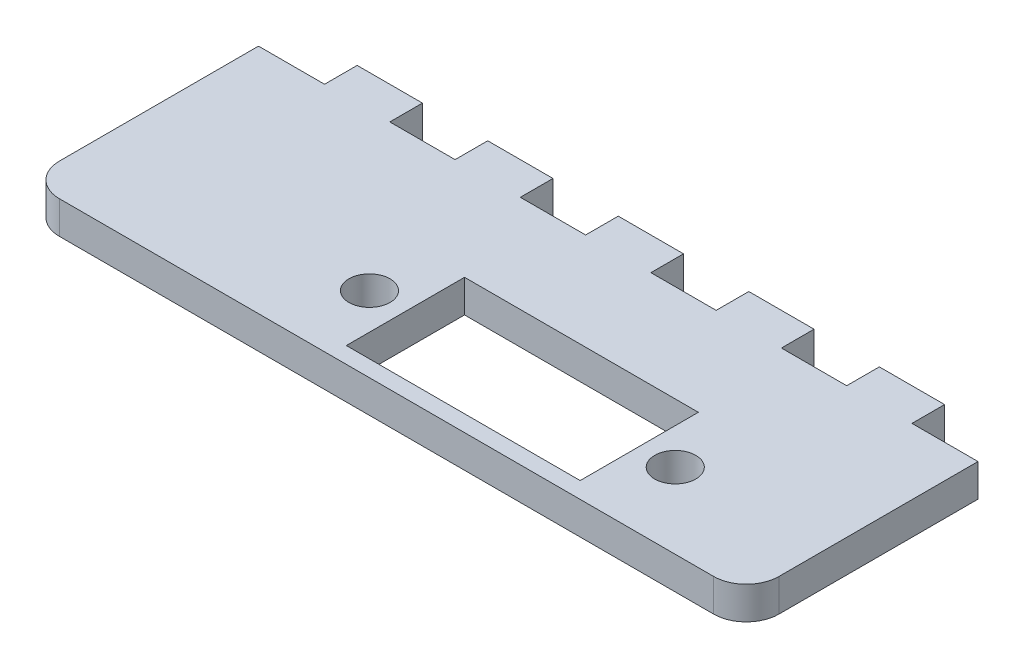
ISO-10303-21;
HEADER;
FILE_DESCRIPTION(('STEP AP214'),'2;1');
FILE_NAME('part.step','',(''),(''),'','','');
FILE_SCHEMA(('AUTOMOTIVE_DESIGN { 1 0 10303 214 1 1 1 1 }'));
ENDSEC;
DATA;
#1=APPLICATION_CONTEXT('core data for automotive mechanical design processes');
#2=APPLICATION_PROTOCOL_DEFINITION('international standard','automotive_design',2000,#1);
#3=PRODUCT_CONTEXT('',#1,'mechanical');
#4=PRODUCT('Part','Part','',(#3));
#5=PRODUCT_RELATED_PRODUCT_CATEGORY('part','',(#4));
#6=PRODUCT_DEFINITION_FORMATION('','',#4);
#7=PRODUCT_DEFINITION_CONTEXT('part definition',#1,'design');
#8=PRODUCT_DEFINITION('design','',#6,#7);
#9=PRODUCT_DEFINITION_SHAPE('','',#8);
#10=(LENGTH_UNIT() NAMED_UNIT(*) SI_UNIT(.MILLI.,.METRE.));
#11=(NAMED_UNIT(*) PLANE_ANGLE_UNIT() SI_UNIT($,.RADIAN.));
#12=(NAMED_UNIT(*) SI_UNIT($,.STERADIAN.) SOLID_ANGLE_UNIT());
#13=UNCERTAINTY_MEASURE_WITH_UNIT(LENGTH_MEASURE(1.E-05),#10,'distance_accuracy_value','');
#14=(GEOMETRIC_REPRESENTATION_CONTEXT(3) GLOBAL_UNCERTAINTY_ASSIGNED_CONTEXT((#13)) GLOBAL_UNIT_ASSIGNED_CONTEXT((#10,
#11,#12)) REPRESENTATION_CONTEXT('',''));
#15=CARTESIAN_POINT('',(0.,0.,0.));
#16=DIRECTION('',(0.,0.,1.));
#17=DIRECTION('',(1.,0.,0.));
#18=AXIS2_PLACEMENT_3D('',#15,#16,#17);
#19=CARTESIAN_POINT('',(0.,3.175,-22.5425));
#20=DIRECTION('',(0.,-1.,0.));
#21=DIRECTION('',(0.,0.,-1.));
#22=AXIS2_PLACEMENT_3D('',#19,#20,#21);
#23=PLANE('',#22);
#24=CARTESIAN_POINT('',(26.,3.175,-7.3375));
#25=DIRECTION('',(0.,1.,0.));
#26=DIRECTION('',(0.,0.,1.));
#27=AXIS2_PLACEMENT_3D('',#24,#25,#26);
#28=CIRCLE('',#27,2.);
#29=CARTESIAN_POINT('',(26.,3.175,-5.3375));
#30=VERTEX_POINT('',#29);
#31=EDGE_CURVE('E267',#30,#30,#28,.T.);
#32=ORIENTED_EDGE('',*,*,#31,.F.);
#33=EDGE_LOOP('',(#32));
#34=FACE_BOUND('',#33,.T.);
#35=DIRECTION('',(0.,0.,1.));
#36=VECTOR('',#35,1.);
#37=CARTESIAN_POINT('',(0.,3.175,0.));
#38=LINE('',#37,#36);
#39=CARTESIAN_POINT('',(0.,3.175,-22.5425));
#40=VERTEX_POINT('',#39);
#41=CARTESIAN_POINT('',(0.,3.175,-3.175));
#42=VERTEX_POINT('',#41);
#43=EDGE_CURVE('E278',#40,#42,#38,.T.);
#44=ORIENTED_EDGE('',*,*,#43,.T.);
#45=CARTESIAN_POINT('',(3.175,3.175,-3.175));
#46=DIRECTION('',(0.,-1.,0.));
#47=DIRECTION('',(0.,0.,-1.));
#48=AXIS2_PLACEMENT_3D('',#45,#46,#47);
#49=CIRCLE('',#48,3.175);
#50=CARTESIAN_POINT('',(3.175,3.175,0.));
#51=VERTEX_POINT('',#50);
#52=EDGE_CURVE('E41',#42,#51,#49,.F.);
#53=ORIENTED_EDGE('',*,*,#52,.T.);
#54=DIRECTION('',(1.,0.,0.));
#55=VECTOR('',#54,1.);
#56=CARTESIAN_POINT('',(0.,3.175,0.));
#57=LINE('',#56,#55);
#58=CARTESIAN_POINT('',(66.825,3.175,0.));
#59=VERTEX_POINT('',#58);
#60=EDGE_CURVE('E280',#51,#59,#57,.T.);
#61=ORIENTED_EDGE('',*,*,#60,.T.);
#62=CARTESIAN_POINT('',(66.825,3.175,-3.175));
#63=DIRECTION('',(0.,-1.,0.));
#64=DIRECTION('',(0.,0.,-1.));
#65=AXIS2_PLACEMENT_3D('',#62,#63,#64);
#66=CIRCLE('',#65,3.175);
#67=CARTESIAN_POINT('',(70.,3.175,-3.175));
#68=VERTEX_POINT('',#67);
#69=EDGE_CURVE('E48',#59,#68,#66,.F.);
#70=ORIENTED_EDGE('',*,*,#69,.T.);
#71=DIRECTION('',(0.,0.,-1.));
#72=VECTOR('',#71,1.);
#73=CARTESIAN_POINT('',(70.,3.175,0.));
#74=LINE('',#73,#72);
#75=CARTESIAN_POINT('',(70.,3.175,-22.5425));
#76=VERTEX_POINT('',#75);
#77=EDGE_CURVE('E283',#68,#76,#74,.T.);
#78=ORIENTED_EDGE('',*,*,#77,.T.);
#79=DIRECTION('',(-1.,0.,0.));
#80=VECTOR('',#79,1.);
#81=CARTESIAN_POINT('',(63.575,3.175,-22.5425));
#82=LINE('',#81,#80);
#83=CARTESIAN_POINT('',(63.575,3.175,-22.5425));
#84=VERTEX_POINT('',#83);
#85=EDGE_CURVE('E285',#76,#84,#82,.T.);
#86=ORIENTED_EDGE('',*,*,#85,.T.);
#87=DIRECTION('',(0.,0.,-1.));
#88=VECTOR('',#87,1.);
#89=CARTESIAN_POINT('',(63.575,3.175,-22.5425));
#90=LINE('',#89,#88);
#91=CARTESIAN_POINT('',(63.575,3.175,-25.7175));
#92=VERTEX_POINT('',#91);
#93=EDGE_CURVE('E287',#84,#92,#90,.T.);
#94=ORIENTED_EDGE('',*,*,#93,.T.);
#95=DIRECTION('',(-1.,0.,0.));
#96=VECTOR('',#95,1.);
#97=CARTESIAN_POINT('',(63.575,3.175,-25.7175));
#98=LINE('',#97,#96);
#99=CARTESIAN_POINT('',(57.225,3.175,-25.7175));
#100=VERTEX_POINT('',#99);
#101=EDGE_CURVE('E289',#92,#100,#98,.T.);
#102=ORIENTED_EDGE('',*,*,#101,.T.);
#103=DIRECTION('',(0.,0.,1.));
#104=VECTOR('',#103,1.);
#105=CARTESIAN_POINT('',(57.225,3.175,-25.7175));
#106=LINE('',#105,#104);
#107=CARTESIAN_POINT('',(57.225,3.175,-22.5425));
#108=VERTEX_POINT('',#107);
#109=EDGE_CURVE('E291',#100,#108,#106,.T.);
#110=ORIENTED_EDGE('',*,*,#109,.T.);
#111=DIRECTION('',(-1.,0.,0.));
#112=VECTOR('',#111,1.);
#113=CARTESIAN_POINT('',(50.875,3.175,-22.5425));
#114=LINE('',#113,#112);
#115=CARTESIAN_POINT('',(50.875,3.175,-22.5425));
#116=VERTEX_POINT('',#115);
#117=EDGE_CURVE('E293',#108,#116,#114,.T.);
#118=ORIENTED_EDGE('',*,*,#117,.T.);
#119=DIRECTION('',(0.,0.,-1.));
#120=VECTOR('',#119,1.);
#121=CARTESIAN_POINT('',(50.875,3.175,-22.5425));
#122=LINE('',#121,#120);
#123=CARTESIAN_POINT('',(50.875,3.175,-25.7175));
#124=VERTEX_POINT('',#123);
#125=EDGE_CURVE('E295',#116,#124,#122,.T.);
#126=ORIENTED_EDGE('',*,*,#125,.T.);
#127=DIRECTION('',(-1.,0.,0.));
#128=VECTOR('',#127,1.);
#129=CARTESIAN_POINT('',(50.875,3.175,-25.7175));
#130=LINE('',#129,#128);
#131=CARTESIAN_POINT('',(44.525,3.175,-25.7175));
#132=VERTEX_POINT('',#131);
#133=EDGE_CURVE('E297',#124,#132,#130,.T.);
#134=ORIENTED_EDGE('',*,*,#133,.T.);
#135=DIRECTION('',(0.,0.,1.));
#136=VECTOR('',#135,1.);
#137=CARTESIAN_POINT('',(44.525,3.175,-25.7175));
#138=LINE('',#137,#136);
#139=CARTESIAN_POINT('',(44.525,3.175,-22.5425));
#140=VERTEX_POINT('',#139);
#141=EDGE_CURVE('E299',#132,#140,#138,.T.);
#142=ORIENTED_EDGE('',*,*,#141,.T.);
#143=DIRECTION('',(-1.,0.,0.));
#144=VECTOR('',#143,1.);
#145=CARTESIAN_POINT('',(38.175,3.175,-22.5425));
#146=LINE('',#145,#144);
#147=CARTESIAN_POINT('',(38.175,3.175,-22.5425));
#148=VERTEX_POINT('',#147);
#149=EDGE_CURVE('E301',#140,#148,#146,.T.);
#150=ORIENTED_EDGE('',*,*,#149,.T.);
#151=DIRECTION('',(0.,0.,-1.));
#152=VECTOR('',#151,1.);
#153=CARTESIAN_POINT('',(38.175,3.175,-22.5425));
#154=LINE('',#153,#152);
#155=CARTESIAN_POINT('',(38.175,3.175,-25.7175));
#156=VERTEX_POINT('',#155);
#157=EDGE_CURVE('E303',#148,#156,#154,.T.);
#158=ORIENTED_EDGE('',*,*,#157,.T.);
#159=DIRECTION('',(-1.,0.,0.));
#160=VECTOR('',#159,1.);
#161=CARTESIAN_POINT('',(38.175,3.175,-25.7175));
#162=LINE('',#161,#160);
#163=CARTESIAN_POINT('',(31.825,3.175,-25.7175));
#164=VERTEX_POINT('',#163);
#165=EDGE_CURVE('E305',#156,#164,#162,.T.);
#166=ORIENTED_EDGE('',*,*,#165,.T.);
#167=DIRECTION('',(0.,0.,1.));
#168=VECTOR('',#167,1.);
#169=CARTESIAN_POINT('',(31.825,3.175,-25.7175));
#170=LINE('',#169,#168);
#171=CARTESIAN_POINT('',(31.825,3.175,-22.5425));
#172=VERTEX_POINT('',#171);
#173=EDGE_CURVE('E307',#164,#172,#170,.T.);
#174=ORIENTED_EDGE('',*,*,#173,.T.);
#175=DIRECTION('',(-1.,0.,0.));
#176=VECTOR('',#175,1.);
#177=CARTESIAN_POINT('',(25.475,3.175,-22.5425));
#178=LINE('',#177,#176);
#179=CARTESIAN_POINT('',(25.475,3.175,-22.5425));
#180=VERTEX_POINT('',#179);
#181=EDGE_CURVE('E309',#172,#180,#178,.T.);
#182=ORIENTED_EDGE('',*,*,#181,.T.);
#183=DIRECTION('',(0.,0.,-1.));
#184=VECTOR('',#183,1.);
#185=CARTESIAN_POINT('',(25.475,3.175,-22.5425));
#186=LINE('',#185,#184);
#187=CARTESIAN_POINT('',(25.475,3.175,-25.7174999999999));
#188=VERTEX_POINT('',#187);
#189=EDGE_CURVE('E311',#180,#188,#186,.T.);
#190=ORIENTED_EDGE('',*,*,#189,.T.);
#191=DIRECTION('',(-1.,0.,0.));
#192=VECTOR('',#191,1.);
#193=CARTESIAN_POINT('',(25.475,3.175,-25.7174999999999));
#194=LINE('',#193,#192);
#195=CARTESIAN_POINT('',(19.125,3.175,-25.7175));
#196=VERTEX_POINT('',#195);
#197=EDGE_CURVE('E313',#188,#196,#194,.T.);
#198=ORIENTED_EDGE('',*,*,#197,.T.);
#199=DIRECTION('',(0.,0.,1.));
#200=VECTOR('',#199,1.);
#201=CARTESIAN_POINT('',(19.125,3.175,-25.7175));
#202=LINE('',#201,#200);
#203=CARTESIAN_POINT('',(19.125,3.175,-22.5425));
#204=VERTEX_POINT('',#203);
#205=EDGE_CURVE('E315',#196,#204,#202,.T.);
#206=ORIENTED_EDGE('',*,*,#205,.T.);
#207=DIRECTION('',(-1.,0.,0.));
#208=VECTOR('',#207,1.);
#209=CARTESIAN_POINT('',(12.775,3.175,-22.5425));
#210=LINE('',#209,#208);
#211=CARTESIAN_POINT('',(12.775,3.175,-22.5425));
#212=VERTEX_POINT('',#211);
#213=EDGE_CURVE('E317',#204,#212,#210,.T.);
#214=ORIENTED_EDGE('',*,*,#213,.T.);
#215=DIRECTION('',(0.,0.,-1.));
#216=VECTOR('',#215,1.);
#217=CARTESIAN_POINT('',(12.775,3.175,-22.5425));
#218=LINE('',#217,#216);
#219=CARTESIAN_POINT('',(12.775,3.175,-25.7175));
#220=VERTEX_POINT('',#219);
#221=EDGE_CURVE('E319',#212,#220,#218,.T.);
#222=ORIENTED_EDGE('',*,*,#221,.T.);
#223=DIRECTION('',(-1.,0.,0.));
#224=VECTOR('',#223,1.);
#225=CARTESIAN_POINT('',(12.775,3.175,-25.7175));
#226=LINE('',#225,#224);
#227=CARTESIAN_POINT('',(6.42500000000001,3.175,-25.7175));
#228=VERTEX_POINT('',#227);
#229=EDGE_CURVE('E321',#220,#228,#226,.T.);
#230=ORIENTED_EDGE('',*,*,#229,.T.);
#231=DIRECTION('',(0.,0.,1.));
#232=VECTOR('',#231,1.);
#233=CARTESIAN_POINT('',(6.42500000000001,3.175,-25.7175));
#234=LINE('',#233,#232);
#235=CARTESIAN_POINT('',(6.42500000000001,3.175,-22.5425));
#236=VERTEX_POINT('',#235);
#237=EDGE_CURVE('E323',#228,#236,#234,.T.);
#238=ORIENTED_EDGE('',*,*,#237,.T.);
#239=DIRECTION('',(-1.,0.,0.));
#240=VECTOR('',#239,1.);
#241=CARTESIAN_POINT('',(0.,3.175,-22.5425));
#242=LINE('',#241,#240);
#243=EDGE_CURVE('E325',#236,#40,#242,.T.);
#244=ORIENTED_EDGE('',*,*,#243,.T.);
#245=EDGE_LOOP('',(#44,#53,#61,#70,#78,#86,#94,#102,#110,#118,#126,#134,#142,#150,#158,#166,
#174,#182,#190,#198,#206,#214,#222,#230,#238,#244));
#246=FACE_BOUND('',#245,.T.);
#247=DIRECTION('',(0.,0.,1.));
#248=VECTOR('',#247,1.);
#249=CARTESIAN_POINT('',(29.5,3.175,-1.5875));
#250=LINE('',#249,#248);
#251=CARTESIAN_POINT('',(29.5,3.175,-13.0875));
#252=VERTEX_POINT('',#251);
#253=CARTESIAN_POINT('',(29.5,3.175,-1.5875));
#254=VERTEX_POINT('',#253);
#255=EDGE_CURVE('E234',#252,#254,#250,.T.);
#256=ORIENTED_EDGE('',*,*,#255,.F.);
#257=DIRECTION('',(-1.,0.,0.));
#258=VECTOR('',#257,1.);
#259=CARTESIAN_POINT('',(29.5,3.175,-13.0875));
#260=LINE('',#259,#258);
#261=CARTESIAN_POINT('',(52.25,3.175,-13.0875));
#262=VERTEX_POINT('',#261);
#263=EDGE_CURVE('E260',#262,#252,#260,.T.);
#264=ORIENTED_EDGE('',*,*,#263,.F.);
#265=DIRECTION('',(0.,0.,-1.));
#266=VECTOR('',#265,1.);
#267=CARTESIAN_POINT('',(52.25,3.175,-1.5875));
#268=LINE('',#267,#266);
#269=CARTESIAN_POINT('',(52.25,3.175,-1.5875));
#270=VERTEX_POINT('',#269);
#271=EDGE_CURVE('E258',#270,#262,#268,.T.);
#272=ORIENTED_EDGE('',*,*,#271,.F.);
#273=DIRECTION('',(1.,0.,0.));
#274=VECTOR('',#273,1.);
#275=CARTESIAN_POINT('',(29.5,3.175,-1.5875));
#276=LINE('',#275,#274);
#277=EDGE_CURVE('E244',#254,#270,#276,.T.);
#278=ORIENTED_EDGE('',*,*,#277,.F.);
#279=EDGE_LOOP('',(#256,#264,#272,#278));
#280=FACE_BOUND('',#279,.T.);
#281=CARTESIAN_POINT('',(55.75,3.175,-7.3375));
#282=DIRECTION('',(0.,1.,0.));
#283=DIRECTION('',(0.,0.,-1.));
#284=AXIS2_PLACEMENT_3D('',#281,#282,#283);
#285=CIRCLE('',#284,2.);
#286=CARTESIAN_POINT('',(55.75,3.175,-9.3375));
#287=VERTEX_POINT('',#286);
#288=EDGE_CURVE('E859',#287,#287,#285,.T.);
#289=ORIENTED_EDGE('',*,*,#288,.F.);
#290=EDGE_LOOP('',(#289));
#291=FACE_BOUND('',#290,.T.);
#292=ADVANCED_FACE('F33',(#34,#246,#280,#291),#23,.F.);
#293=CARTESIAN_POINT('',(0.,0.,-22.5425));
#294=DIRECTION('',(0.,-1.,0.));
#295=DIRECTION('',(0.,0.,-1.));
#296=AXIS2_PLACEMENT_3D('',#293,#294,#295);
#297=PLANE('',#296);
#298=CARTESIAN_POINT('',(26.,0.,-7.3375));
#299=DIRECTION('',(0.,1.,0.));
#300=DIRECTION('',(0.,0.,1.));
#301=AXIS2_PLACEMENT_3D('',#298,#299,#300);
#302=CIRCLE('',#301,2.);
#303=CARTESIAN_POINT('',(26.,0.,-5.3375));
#304=VERTEX_POINT('',#303);
#305=EDGE_CURVE('E865',#304,#304,#302,.T.);
#306=ORIENTED_EDGE('',*,*,#305,.T.);
#307=EDGE_LOOP('',(#306));
#308=FACE_BOUND('',#307,.T.);
#309=DIRECTION('',(1.,0.,0.));
#310=VECTOR('',#309,1.);
#311=CARTESIAN_POINT('',(0.,0.,0.));
#312=LINE('',#311,#310);
#313=CARTESIAN_POINT('',(3.175,0.,0.));
#314=VERTEX_POINT('',#313);
#315=CARTESIAN_POINT('',(66.825,0.,0.));
#316=VERTEX_POINT('',#315);
#317=EDGE_CURVE('E329',#314,#316,#312,.T.);
#318=ORIENTED_EDGE('',*,*,#317,.F.);
#319=CARTESIAN_POINT('',(3.175,0.,-3.175));
#320=DIRECTION('',(0.,-1.,0.));
#321=DIRECTION('',(0.,0.,-1.));
#322=AXIS2_PLACEMENT_3D('',#319,#320,#321);
#323=CIRCLE('',#322,3.175);
#324=CARTESIAN_POINT('',(0.,0.,-3.175));
#325=VERTEX_POINT('',#324);
#326=EDGE_CURVE('E447',#314,#325,#323,.T.);
#327=ORIENTED_EDGE('',*,*,#326,.T.);
#328=DIRECTION('',(0.,0.,1.));
#329=VECTOR('',#328,1.);
#330=CARTESIAN_POINT('',(0.,0.,0.));
#331=LINE('',#330,#329);
#332=CARTESIAN_POINT('',(0.,0.,-22.5425));
#333=VERTEX_POINT('',#332);
#334=EDGE_CURVE('E252',#333,#325,#331,.T.);
#335=ORIENTED_EDGE('',*,*,#334,.F.);
#336=DIRECTION('',(-1.,0.,0.));
#337=VECTOR('',#336,1.);
#338=CARTESIAN_POINT('',(0.,0.,-22.5425));
#339=LINE('',#338,#337);
#340=CARTESIAN_POINT('',(6.42500000000001,0.,-22.5425));
#341=VERTEX_POINT('',#340);
#342=EDGE_CURVE('E281',#341,#333,#339,.T.);
#343=ORIENTED_EDGE('',*,*,#342,.F.);
#344=DIRECTION('',(0.,0.,1.));
#345=VECTOR('',#344,1.);
#346=CARTESIAN_POINT('',(6.42500000000001,0.,-25.7175));
#347=LINE('',#346,#345);
#348=CARTESIAN_POINT('',(6.42500000000001,0.,-25.7175));
#349=VERTEX_POINT('',#348);
#350=EDGE_CURVE('E372',#349,#341,#347,.T.);
#351=ORIENTED_EDGE('',*,*,#350,.F.);
#352=DIRECTION('',(-1.,0.,0.));
#353=VECTOR('',#352,1.);
#354=CARTESIAN_POINT('',(12.775,0.,-25.7175));
#355=LINE('',#354,#353);
#356=CARTESIAN_POINT('',(12.775,0.,-25.7175));
#357=VERTEX_POINT('',#356);
#358=EDGE_CURVE('E370',#357,#349,#355,.T.);
#359=ORIENTED_EDGE('',*,*,#358,.F.);
#360=DIRECTION('',(0.,0.,-1.));
#361=VECTOR('',#360,1.);
#362=CARTESIAN_POINT('',(12.775,0.,-22.5425));
#363=LINE('',#362,#361);
#364=CARTESIAN_POINT('',(12.775,0.,-22.5425));
#365=VERTEX_POINT('',#364);
#366=EDGE_CURVE('E368',#365,#357,#363,.T.);
#367=ORIENTED_EDGE('',*,*,#366,.F.);
#368=DIRECTION('',(-1.,0.,0.));
#369=VECTOR('',#368,1.);
#370=CARTESIAN_POINT('',(12.775,0.,-22.5425));
#371=LINE('',#370,#369);
#372=CARTESIAN_POINT('',(19.125,0.,-22.5425));
#373=VERTEX_POINT('',#372);
#374=EDGE_CURVE('E366',#373,#365,#371,.T.);
#375=ORIENTED_EDGE('',*,*,#374,.F.);
#376=DIRECTION('',(0.,0.,1.));
#377=VECTOR('',#376,1.);
#378=CARTESIAN_POINT('',(19.125,0.,-25.7175));
#379=LINE('',#378,#377);
#380=CARTESIAN_POINT('',(19.125,0.,-25.7175));
#381=VERTEX_POINT('',#380);
#382=EDGE_CURVE('E364',#381,#373,#379,.T.);
#383=ORIENTED_EDGE('',*,*,#382,.F.);
#384=DIRECTION('',(-1.,0.,0.));
#385=VECTOR('',#384,1.);
#386=CARTESIAN_POINT('',(25.475,0.,-25.7174999999999));
#387=LINE('',#386,#385);
#388=CARTESIAN_POINT('',(25.475,0.,-25.7174999999999));
#389=VERTEX_POINT('',#388);
#390=EDGE_CURVE('E362',#389,#381,#387,.T.);
#391=ORIENTED_EDGE('',*,*,#390,.F.);
#392=DIRECTION('',(0.,0.,-1.));
#393=VECTOR('',#392,1.);
#394=CARTESIAN_POINT('',(25.475,0.,-22.5425));
#395=LINE('',#394,#393);
#396=CARTESIAN_POINT('',(25.475,0.,-22.5425));
#397=VERTEX_POINT('',#396);
#398=EDGE_CURVE('E360',#397,#389,#395,.T.);
#399=ORIENTED_EDGE('',*,*,#398,.F.);
#400=DIRECTION('',(-1.,0.,0.));
#401=VECTOR('',#400,1.);
#402=CARTESIAN_POINT('',(25.475,0.,-22.5425));
#403=LINE('',#402,#401);
#404=CARTESIAN_POINT('',(31.825,0.,-22.5425));
#405=VERTEX_POINT('',#404);
#406=EDGE_CURVE('E358',#405,#397,#403,.T.);
#407=ORIENTED_EDGE('',*,*,#406,.F.);
#408=DIRECTION('',(0.,0.,1.));
#409=VECTOR('',#408,1.);
#410=CARTESIAN_POINT('',(31.825,0.,-25.7175));
#411=LINE('',#410,#409);
#412=CARTESIAN_POINT('',(31.825,0.,-25.7175));
#413=VERTEX_POINT('',#412);
#414=EDGE_CURVE('E356',#413,#405,#411,.T.);
#415=ORIENTED_EDGE('',*,*,#414,.F.);
#416=DIRECTION('',(-1.,0.,0.));
#417=VECTOR('',#416,1.);
#418=CARTESIAN_POINT('',(38.175,0.,-25.7175));
#419=LINE('',#418,#417);
#420=CARTESIAN_POINT('',(38.175,0.,-25.7175));
#421=VERTEX_POINT('',#420);
#422=EDGE_CURVE('E354',#421,#413,#419,.T.);
#423=ORIENTED_EDGE('',*,*,#422,.F.);
#424=DIRECTION('',(0.,0.,-1.));
#425=VECTOR('',#424,1.);
#426=CARTESIAN_POINT('',(38.175,0.,-22.5425));
#427=LINE('',#426,#425);
#428=CARTESIAN_POINT('',(38.175,0.,-22.5425));
#429=VERTEX_POINT('',#428);
#430=EDGE_CURVE('E352',#429,#421,#427,.T.);
#431=ORIENTED_EDGE('',*,*,#430,.F.);
#432=DIRECTION('',(-1.,0.,0.));
#433=VECTOR('',#432,1.);
#434=CARTESIAN_POINT('',(38.175,0.,-22.5425));
#435=LINE('',#434,#433);
#436=CARTESIAN_POINT('',(44.525,0.,-22.5425));
#437=VERTEX_POINT('',#436);
#438=EDGE_CURVE('E350',#437,#429,#435,.T.);
#439=ORIENTED_EDGE('',*,*,#438,.F.);
#440=DIRECTION('',(0.,0.,1.));
#441=VECTOR('',#440,1.);
#442=CARTESIAN_POINT('',(44.525,0.,-25.7175));
#443=LINE('',#442,#441);
#444=CARTESIAN_POINT('',(44.525,0.,-25.7175));
#445=VERTEX_POINT('',#444);
#446=EDGE_CURVE('E348',#445,#437,#443,.T.);
#447=ORIENTED_EDGE('',*,*,#446,.F.);
#448=DIRECTION('',(-1.,0.,0.));
#449=VECTOR('',#448,1.);
#450=CARTESIAN_POINT('',(50.875,0.,-25.7175));
#451=LINE('',#450,#449);
#452=CARTESIAN_POINT('',(50.875,0.,-25.7175));
#453=VERTEX_POINT('',#452);
#454=EDGE_CURVE('E346',#453,#445,#451,.T.);
#455=ORIENTED_EDGE('',*,*,#454,.F.);
#456=DIRECTION('',(0.,0.,-1.));
#457=VECTOR('',#456,1.);
#458=CARTESIAN_POINT('',(50.875,0.,-22.5425));
#459=LINE('',#458,#457);
#460=CARTESIAN_POINT('',(50.875,0.,-22.5425));
#461=VERTEX_POINT('',#460);
#462=EDGE_CURVE('E344',#461,#453,#459,.T.);
#463=ORIENTED_EDGE('',*,*,#462,.F.);
#464=DIRECTION('',(-1.,0.,0.));
#465=VECTOR('',#464,1.);
#466=CARTESIAN_POINT('',(50.875,0.,-22.5425));
#467=LINE('',#466,#465);
#468=CARTESIAN_POINT('',(57.225,0.,-22.5425));
#469=VERTEX_POINT('',#468);
#470=EDGE_CURVE('E342',#469,#461,#467,.T.);
#471=ORIENTED_EDGE('',*,*,#470,.F.);
#472=DIRECTION('',(0.,0.,1.));
#473=VECTOR('',#472,1.);
#474=CARTESIAN_POINT('',(57.225,0.,-25.7175));
#475=LINE('',#474,#473);
#476=CARTESIAN_POINT('',(57.225,0.,-25.7175));
#477=VERTEX_POINT('',#476);
#478=EDGE_CURVE('E340',#477,#469,#475,.T.);
#479=ORIENTED_EDGE('',*,*,#478,.F.);
#480=DIRECTION('',(-1.,0.,0.));
#481=VECTOR('',#480,1.);
#482=CARTESIAN_POINT('',(63.575,0.,-25.7175));
#483=LINE('',#482,#481);
#484=CARTESIAN_POINT('',(63.575,0.,-25.7175));
#485=VERTEX_POINT('',#484);
#486=EDGE_CURVE('E338',#485,#477,#483,.T.);
#487=ORIENTED_EDGE('',*,*,#486,.F.);
#488=DIRECTION('',(0.,0.,-1.));
#489=VECTOR('',#488,1.);
#490=CARTESIAN_POINT('',(63.575,0.,-22.5425));
#491=LINE('',#490,#489);
#492=CARTESIAN_POINT('',(63.575,0.,-22.5425));
#493=VERTEX_POINT('',#492);
#494=EDGE_CURVE('E336',#493,#485,#491,.T.);
#495=ORIENTED_EDGE('',*,*,#494,.F.);
#496=DIRECTION('',(-1.,0.,0.));
#497=VECTOR('',#496,1.);
#498=CARTESIAN_POINT('',(63.575,0.,-22.5425));
#499=LINE('',#498,#497);
#500=CARTESIAN_POINT('',(70.,0.,-22.5425));
#501=VERTEX_POINT('',#500);
#502=EDGE_CURVE('E334',#501,#493,#499,.T.);
#503=ORIENTED_EDGE('',*,*,#502,.F.);
#504=DIRECTION('',(0.,0.,-1.));
#505=VECTOR('',#504,1.);
#506=CARTESIAN_POINT('',(70.,0.,0.));
#507=LINE('',#506,#505);
#508=CARTESIAN_POINT('',(70.,0.,-3.175));
#509=VERTEX_POINT('',#508);
#510=EDGE_CURVE('E332',#509,#501,#507,.T.);
#511=ORIENTED_EDGE('',*,*,#510,.F.);
#512=CARTESIAN_POINT('',(66.825,0.,-3.175));
#513=DIRECTION('',(0.,-1.,0.));
#514=DIRECTION('',(0.,0.,-1.));
#515=AXIS2_PLACEMENT_3D('',#512,#513,#514);
#516=CIRCLE('',#515,3.175);
#517=EDGE_CURVE('E445',#509,#316,#516,.T.);
#518=ORIENTED_EDGE('',*,*,#517,.T.);
#519=EDGE_LOOP('',(#318,#327,#335,#343,#351,#359,#367,#375,#383,#391,#399,#407,#415,#423,#431,
#439,#447,#455,#463,#471,#479,#487,#495,#503,#511,#518));
#520=FACE_BOUND('',#519,.T.);
#521=DIRECTION('',(-1.,0.,0.));
#522=VECTOR('',#521,1.);
#523=CARTESIAN_POINT('',(29.5,0.,-13.0875));
#524=LINE('',#523,#522);
#525=CARTESIAN_POINT('',(52.25,0.,-13.0875));
#526=VERTEX_POINT('',#525);
#527=CARTESIAN_POINT('',(29.5,0.,-13.0875));
#528=VERTEX_POINT('',#527);
#529=EDGE_CURVE('E245',#526,#528,#524,.T.);
#530=ORIENTED_EDGE('',*,*,#529,.T.);
#531=DIRECTION('',(0.,0.,1.));
#532=VECTOR('',#531,1.);
#533=CARTESIAN_POINT('',(29.5,0.,-1.5875));
#534=LINE('',#533,#532);
#535=CARTESIAN_POINT('',(29.5,0.,-1.5875));
#536=VERTEX_POINT('',#535);
#537=EDGE_CURVE('E265',#528,#536,#534,.T.);
#538=ORIENTED_EDGE('',*,*,#537,.T.);
#539=DIRECTION('',(1.,0.,0.));
#540=VECTOR('',#539,1.);
#541=CARTESIAN_POINT('',(29.5,0.,-1.5875));
#542=LINE('',#541,#540);
#543=CARTESIAN_POINT('',(52.25,0.,-1.5875));
#544=VERTEX_POINT('',#543);
#545=EDGE_CURVE('E251',#536,#544,#542,.T.);
#546=ORIENTED_EDGE('',*,*,#545,.T.);
#547=DIRECTION('',(0.,0.,-1.));
#548=VECTOR('',#547,1.);
#549=CARTESIAN_POINT('',(52.25,0.,-1.5875));
#550=LINE('',#549,#548);
#551=EDGE_CURVE('E269',#544,#526,#550,.T.);
#552=ORIENTED_EDGE('',*,*,#551,.T.);
#553=EDGE_LOOP('',(#530,#538,#546,#552));
#554=FACE_BOUND('',#553,.T.);
#555=CARTESIAN_POINT('',(55.75,0.,-7.3375));
#556=DIRECTION('',(0.,1.,0.));
#557=DIRECTION('',(0.,0.,-1.));
#558=AXIS2_PLACEMENT_3D('',#555,#556,#557);
#559=CIRCLE('',#558,2.);
#560=CARTESIAN_POINT('',(55.75,0.,-9.3375));
#561=VERTEX_POINT('',#560);
#562=EDGE_CURVE('E862',#561,#561,#559,.T.);
#563=ORIENTED_EDGE('',*,*,#562,.T.);
#564=EDGE_LOOP('',(#563));
#565=FACE_BOUND('',#564,.T.);
#566=ADVANCED_FACE('F461',(#308,#520,#554,#565),#297,.T.);
#567=CARTESIAN_POINT('',(0.,3.175,0.));
#568=DIRECTION('',(1.,0.,0.));
#569=DIRECTION('',(0.,0.,-1.));
#570=AXIS2_PLACEMENT_3D('',#567,#568,#569);
#571=PLANE('',#570);
#572=ORIENTED_EDGE('',*,*,#334,.T.);
#573=DIRECTION('',(0.,-1.,0.));
#574=VECTOR('',#573,1.);
#575=CARTESIAN_POINT('',(0.,3.175,-3.175));
#576=LINE('',#575,#574);
#577=EDGE_CURVE('E56',#325,#42,#576,.F.);
#578=ORIENTED_EDGE('',*,*,#577,.T.);
#579=ORIENTED_EDGE('',*,*,#43,.F.);
#580=DIRECTION('',(0.,-1.,0.));
#581=VECTOR('',#580,1.);
#582=CARTESIAN_POINT('',(0.,3.175,-22.5425));
#583=LINE('',#582,#581);
#584=EDGE_CURVE('E327',#40,#333,#583,.T.);
#585=ORIENTED_EDGE('',*,*,#584,.T.);
#586=EDGE_LOOP('',(#572,#578,#579,#585));
#587=FACE_BOUND('',#586,.T.);
#588=ADVANCED_FACE('F464',(#587),#571,.F.);
#589=CARTESIAN_POINT('',(0.,3.175,0.));
#590=DIRECTION('',(0.,0.,-1.));
#591=DIRECTION('',(-1.,0.,0.));
#592=AXIS2_PLACEMENT_3D('',#589,#590,#591);
#593=PLANE('',#592);
#594=ORIENTED_EDGE('',*,*,#60,.F.);
#595=DIRECTION('',(0.,-1.,0.));
#596=VECTOR('',#595,1.);
#597=CARTESIAN_POINT('',(3.175,3.175,0.));
#598=LINE('',#597,#596);
#599=EDGE_CURVE('E442',#51,#314,#598,.T.);
#600=ORIENTED_EDGE('',*,*,#599,.T.);
#601=ORIENTED_EDGE('',*,*,#317,.T.);
#602=DIRECTION('',(0.,-1.,0.));
#603=VECTOR('',#602,1.);
#604=CARTESIAN_POINT('',(66.825,3.175,0.));
#605=LINE('',#604,#603);
#606=EDGE_CURVE('E440',#316,#59,#605,.F.);
#607=ORIENTED_EDGE('',*,*,#606,.T.);
#608=EDGE_LOOP('',(#594,#600,#601,#607));
#609=FACE_BOUND('',#608,.T.);
#610=ADVANCED_FACE('F455',(#609),#593,.F.);
#611=CARTESIAN_POINT('',(70.,3.175,0.));
#612=DIRECTION('',(-1.,0.,0.));
#613=DIRECTION('',(0.,0.,1.));
#614=AXIS2_PLACEMENT_3D('',#611,#612,#613);
#615=PLANE('',#614);
#616=ORIENTED_EDGE('',*,*,#77,.F.);
#617=DIRECTION('',(0.,-1.,0.));
#618=VECTOR('',#617,1.);
#619=CARTESIAN_POINT('',(70.,3.175,-3.175));
#620=LINE('',#619,#618);
#621=EDGE_CURVE('E11',#68,#509,#620,.T.);
#622=ORIENTED_EDGE('',*,*,#621,.T.);
#623=ORIENTED_EDGE('',*,*,#510,.T.);
#624=DIRECTION('',(0.,-1.,0.));
#625=VECTOR('',#624,1.);
#626=CARTESIAN_POINT('',(70.,3.175,-22.5425));
#627=LINE('',#626,#625);
#628=EDGE_CURVE('E437',#76,#501,#627,.T.);
#629=ORIENTED_EDGE('',*,*,#628,.F.);
#630=EDGE_LOOP('',(#616,#622,#623,#629));
#631=FACE_BOUND('',#630,.T.);
#632=ADVANCED_FACE('F572',(#631),#615,.F.);
#633=CARTESIAN_POINT('',(63.575,3.175,-22.5425));
#634=DIRECTION('',(0.,0.,1.));
#635=DIRECTION('',(1.,0.,0.));
#636=AXIS2_PLACEMENT_3D('',#633,#634,#635);
#637=PLANE('',#636);
#638=ORIENTED_EDGE('',*,*,#502,.T.);
#639=DIRECTION('',(0.,-1.,0.));
#640=VECTOR('',#639,1.);
#641=CARTESIAN_POINT('',(63.575,3.175,-22.5425));
#642=LINE('',#641,#640);
#643=EDGE_CURVE('E434',#84,#493,#642,.T.);
#644=ORIENTED_EDGE('',*,*,#643,.F.);
#645=ORIENTED_EDGE('',*,*,#85,.F.);
#646=ORIENTED_EDGE('',*,*,#628,.T.);
#647=EDGE_LOOP('',(#638,#644,#645,#646));
#648=FACE_BOUND('',#647,.T.);
#649=ADVANCED_FACE('F569',(#648),#637,.F.);
#650=CARTESIAN_POINT('',(63.575,3.175,-22.5425));
#651=DIRECTION('',(-1.,0.,0.));
#652=DIRECTION('',(0.,0.,1.));
#653=AXIS2_PLACEMENT_3D('',#650,#651,#652);
#654=PLANE('',#653);
#655=ORIENTED_EDGE('',*,*,#494,.T.);
#656=DIRECTION('',(0.,-1.,0.));
#657=VECTOR('',#656,1.);
#658=CARTESIAN_POINT('',(63.575,3.175,-25.7175));
#659=LINE('',#658,#657);
#660=EDGE_CURVE('E431',#92,#485,#659,.T.);
#661=ORIENTED_EDGE('',*,*,#660,.F.);
#662=ORIENTED_EDGE('',*,*,#93,.F.);
#663=ORIENTED_EDGE('',*,*,#643,.T.);
#664=EDGE_LOOP('',(#655,#661,#662,#663));
#665=FACE_BOUND('',#664,.T.);
#666=ADVANCED_FACE('F564',(#665),#654,.F.);
#667=CARTESIAN_POINT('',(63.575,3.175,-25.7175));
#668=DIRECTION('',(0.,0.,1.));
#669=DIRECTION('',(1.,0.,0.));
#670=AXIS2_PLACEMENT_3D('',#667,#668,#669);
#671=PLANE('',#670);
#672=ORIENTED_EDGE('',*,*,#486,.T.);
#673=DIRECTION('',(0.,-1.,0.));
#674=VECTOR('',#673,1.);
#675=CARTESIAN_POINT('',(57.225,3.175,-25.7175));
#676=LINE('',#675,#674);
#677=EDGE_CURVE('E428',#100,#477,#676,.T.);
#678=ORIENTED_EDGE('',*,*,#677,.F.);
#679=ORIENTED_EDGE('',*,*,#101,.F.);
#680=ORIENTED_EDGE('',*,*,#660,.T.);
#681=EDGE_LOOP('',(#672,#678,#679,#680));
#682=FACE_BOUND('',#681,.T.);
#683=ADVANCED_FACE('F558',(#682),#671,.F.);
#684=CARTESIAN_POINT('',(57.225,3.175,-25.7175));
#685=DIRECTION('',(1.,0.,0.));
#686=DIRECTION('',(0.,0.,-1.));
#687=AXIS2_PLACEMENT_3D('',#684,#685,#686);
#688=PLANE('',#687);
#689=ORIENTED_EDGE('',*,*,#478,.T.);
#690=DIRECTION('',(0.,-1.,0.));
#691=VECTOR('',#690,1.);
#692=CARTESIAN_POINT('',(57.225,3.175,-22.5425));
#693=LINE('',#692,#691);
#694=EDGE_CURVE('E425',#108,#469,#693,.T.);
#695=ORIENTED_EDGE('',*,*,#694,.F.);
#696=ORIENTED_EDGE('',*,*,#109,.F.);
#697=ORIENTED_EDGE('',*,*,#677,.T.);
#698=EDGE_LOOP('',(#689,#695,#696,#697));
#699=FACE_BOUND('',#698,.T.);
#700=ADVANCED_FACE('F554',(#699),#688,.F.);
#701=CARTESIAN_POINT('',(50.875,3.175,-22.5425));
#702=DIRECTION('',(0.,0.,1.));
#703=DIRECTION('',(1.,0.,0.));
#704=AXIS2_PLACEMENT_3D('',#701,#702,#703);
#705=PLANE('',#704);
#706=ORIENTED_EDGE('',*,*,#470,.T.);
#707=DIRECTION('',(0.,-1.,0.));
#708=VECTOR('',#707,1.);
#709=CARTESIAN_POINT('',(50.875,3.175,-22.5425));
#710=LINE('',#709,#708);
#711=EDGE_CURVE('E422',#116,#461,#710,.T.);
#712=ORIENTED_EDGE('',*,*,#711,.F.);
#713=ORIENTED_EDGE('',*,*,#117,.F.);
#714=ORIENTED_EDGE('',*,*,#694,.T.);
#715=EDGE_LOOP('',(#706,#712,#713,#714));
#716=FACE_BOUND('',#715,.T.);
#717=ADVANCED_FACE('F549',(#716),#705,.F.);
#718=CARTESIAN_POINT('',(50.875,3.175,-22.5425));
#719=DIRECTION('',(-1.,0.,0.));
#720=DIRECTION('',(0.,0.,1.));
#721=AXIS2_PLACEMENT_3D('',#718,#719,#720);
#722=PLANE('',#721);
#723=ORIENTED_EDGE('',*,*,#462,.T.);
#724=DIRECTION('',(0.,-1.,0.));
#725=VECTOR('',#724,1.);
#726=CARTESIAN_POINT('',(50.875,3.175,-25.7175));
#727=LINE('',#726,#725);
#728=EDGE_CURVE('E419',#124,#453,#727,.T.);
#729=ORIENTED_EDGE('',*,*,#728,.F.);
#730=ORIENTED_EDGE('',*,*,#125,.F.);
#731=ORIENTED_EDGE('',*,*,#711,.T.);
#732=EDGE_LOOP('',(#723,#729,#730,#731));
#733=FACE_BOUND('',#732,.T.);
#734=ADVANCED_FACE('F543',(#733),#722,.F.);
#735=CARTESIAN_POINT('',(50.875,3.175,-25.7175));
#736=DIRECTION('',(0.,0.,1.));
#737=DIRECTION('',(1.,0.,0.));
#738=AXIS2_PLACEMENT_3D('',#735,#736,#737);
#739=PLANE('',#738);
#740=ORIENTED_EDGE('',*,*,#454,.T.);
#741=DIRECTION('',(0.,-1.,0.));
#742=VECTOR('',#741,1.);
#743=CARTESIAN_POINT('',(44.525,3.175,-25.7175));
#744=LINE('',#743,#742);
#745=EDGE_CURVE('E416',#132,#445,#744,.T.);
#746=ORIENTED_EDGE('',*,*,#745,.F.);
#747=ORIENTED_EDGE('',*,*,#133,.F.);
#748=ORIENTED_EDGE('',*,*,#728,.T.);
#749=EDGE_LOOP('',(#740,#746,#747,#748));
#750=FACE_BOUND('',#749,.T.);
#751=ADVANCED_FACE('F539',(#750),#739,.F.);
#752=CARTESIAN_POINT('',(44.525,3.175,-25.7175));
#753=DIRECTION('',(1.,0.,0.));
#754=DIRECTION('',(0.,0.,-1.));
#755=AXIS2_PLACEMENT_3D('',#752,#753,#754);
#756=PLANE('',#755);
#757=ORIENTED_EDGE('',*,*,#446,.T.);
#758=DIRECTION('',(0.,-1.,0.));
#759=VECTOR('',#758,1.);
#760=CARTESIAN_POINT('',(44.525,3.175,-22.5425));
#761=LINE('',#760,#759);
#762=EDGE_CURVE('E413',#140,#437,#761,.T.);
#763=ORIENTED_EDGE('',*,*,#762,.F.);
#764=ORIENTED_EDGE('',*,*,#141,.F.);
#765=ORIENTED_EDGE('',*,*,#745,.T.);
#766=EDGE_LOOP('',(#757,#763,#764,#765));
#767=FACE_BOUND('',#766,.T.);
#768=ADVANCED_FACE('F534',(#767),#756,.F.);
#769=CARTESIAN_POINT('',(38.175,3.175,-22.5425));
#770=DIRECTION('',(0.,0.,1.));
#771=DIRECTION('',(1.,0.,0.));
#772=AXIS2_PLACEMENT_3D('',#769,#770,#771);
#773=PLANE('',#772);
#774=ORIENTED_EDGE('',*,*,#438,.T.);
#775=DIRECTION('',(0.,-1.,0.));
#776=VECTOR('',#775,1.);
#777=CARTESIAN_POINT('',(38.175,3.175,-22.5425));
#778=LINE('',#777,#776);
#779=EDGE_CURVE('E410',#148,#429,#778,.T.);
#780=ORIENTED_EDGE('',*,*,#779,.F.);
#781=ORIENTED_EDGE('',*,*,#149,.F.);
#782=ORIENTED_EDGE('',*,*,#762,.T.);
#783=EDGE_LOOP('',(#774,#780,#781,#782));
#784=FACE_BOUND('',#783,.T.);
#785=ADVANCED_FACE('F528',(#784),#773,.F.);
#786=CARTESIAN_POINT('',(38.175,3.175,-22.5425));
#787=DIRECTION('',(-1.,0.,0.));
#788=DIRECTION('',(0.,0.,1.));
#789=AXIS2_PLACEMENT_3D('',#786,#787,#788);
#790=PLANE('',#789);
#791=ORIENTED_EDGE('',*,*,#430,.T.);
#792=DIRECTION('',(0.,-1.,0.));
#793=VECTOR('',#792,1.);
#794=CARTESIAN_POINT('',(38.175,3.175,-25.7175));
#795=LINE('',#794,#793);
#796=EDGE_CURVE('E407',#156,#421,#795,.T.);
#797=ORIENTED_EDGE('',*,*,#796,.F.);
#798=ORIENTED_EDGE('',*,*,#157,.F.);
#799=ORIENTED_EDGE('',*,*,#779,.T.);
#800=EDGE_LOOP('',(#791,#797,#798,#799));
#801=FACE_BOUND('',#800,.T.);
#802=ADVANCED_FACE('F524',(#801),#790,.F.);
#803=CARTESIAN_POINT('',(38.175,3.175,-25.7175));
#804=DIRECTION('',(0.,0.,1.));
#805=DIRECTION('',(1.,0.,0.));
#806=AXIS2_PLACEMENT_3D('',#803,#804,#805);
#807=PLANE('',#806);
#808=ORIENTED_EDGE('',*,*,#422,.T.);
#809=DIRECTION('',(0.,-1.,0.));
#810=VECTOR('',#809,1.);
#811=CARTESIAN_POINT('',(31.825,3.175,-25.7175));
#812=LINE('',#811,#810);
#813=EDGE_CURVE('E404',#164,#413,#812,.T.);
#814=ORIENTED_EDGE('',*,*,#813,.F.);
#815=ORIENTED_EDGE('',*,*,#165,.F.);
#816=ORIENTED_EDGE('',*,*,#796,.T.);
#817=EDGE_LOOP('',(#808,#814,#815,#816));
#818=FACE_BOUND('',#817,.T.);
#819=ADVANCED_FACE('F519',(#818),#807,.F.);
#820=CARTESIAN_POINT('',(31.825,3.175,-25.7175));
#821=DIRECTION('',(1.,0.,0.));
#822=DIRECTION('',(0.,0.,-1.));
#823=AXIS2_PLACEMENT_3D('',#820,#821,#822);
#824=PLANE('',#823);
#825=ORIENTED_EDGE('',*,*,#414,.T.);
#826=DIRECTION('',(0.,-1.,0.));
#827=VECTOR('',#826,1.);
#828=CARTESIAN_POINT('',(31.825,3.175,-22.5425));
#829=LINE('',#828,#827);
#830=EDGE_CURVE('E401',#172,#405,#829,.T.);
#831=ORIENTED_EDGE('',*,*,#830,.F.);
#832=ORIENTED_EDGE('',*,*,#173,.F.);
#833=ORIENTED_EDGE('',*,*,#813,.T.);
#834=EDGE_LOOP('',(#825,#831,#832,#833));
#835=FACE_BOUND('',#834,.T.);
#836=ADVANCED_FACE('F513',(#835),#824,.F.);
#837=CARTESIAN_POINT('',(25.475,3.175,-22.5425));
#838=DIRECTION('',(0.,0.,1.));
#839=DIRECTION('',(1.,0.,0.));
#840=AXIS2_PLACEMENT_3D('',#837,#838,#839);
#841=PLANE('',#840);
#842=ORIENTED_EDGE('',*,*,#406,.T.);
#843=DIRECTION('',(0.,-1.,0.));
#844=VECTOR('',#843,1.);
#845=CARTESIAN_POINT('',(25.475,3.175,-22.5425));
#846=LINE('',#845,#844);
#847=EDGE_CURVE('E398',#180,#397,#846,.T.);
#848=ORIENTED_EDGE('',*,*,#847,.F.);
#849=ORIENTED_EDGE('',*,*,#181,.F.);
#850=ORIENTED_EDGE('',*,*,#830,.T.);
#851=EDGE_LOOP('',(#842,#848,#849,#850));
#852=FACE_BOUND('',#851,.T.);
#853=ADVANCED_FACE('F509',(#852),#841,.F.);
#854=CARTESIAN_POINT('',(25.475,3.175,-22.5425));
#855=DIRECTION('',(-1.,0.,0.));
#856=DIRECTION('',(0.,0.,1.));
#857=AXIS2_PLACEMENT_3D('',#854,#855,#856);
#858=PLANE('',#857);
#859=ORIENTED_EDGE('',*,*,#398,.T.);
#860=DIRECTION('',(0.,-1.,0.));
#861=VECTOR('',#860,1.);
#862=CARTESIAN_POINT('',(25.475,3.175,-25.7174999999999));
#863=LINE('',#862,#861);
#864=EDGE_CURVE('E395',#188,#389,#863,.T.);
#865=ORIENTED_EDGE('',*,*,#864,.F.);
#866=ORIENTED_EDGE('',*,*,#189,.F.);
#867=ORIENTED_EDGE('',*,*,#847,.T.);
#868=EDGE_LOOP('',(#859,#865,#866,#867));
#869=FACE_BOUND('',#868,.T.);
#870=ADVANCED_FACE('F504',(#869),#858,.F.);
#871=CARTESIAN_POINT('',(25.475,3.175,-25.7174999999999));
#872=DIRECTION('',(0.,0.,1.));
#873=DIRECTION('',(1.,0.,0.));
#874=AXIS2_PLACEMENT_3D('',#871,#872,#873);
#875=PLANE('',#874);
#876=ORIENTED_EDGE('',*,*,#390,.T.);
#877=DIRECTION('',(0.,-1.,0.));
#878=VECTOR('',#877,1.);
#879=CARTESIAN_POINT('',(19.125,3.175,-25.7175));
#880=LINE('',#879,#878);
#881=EDGE_CURVE('E392',#196,#381,#880,.T.);
#882=ORIENTED_EDGE('',*,*,#881,.F.);
#883=ORIENTED_EDGE('',*,*,#197,.F.);
#884=ORIENTED_EDGE('',*,*,#864,.T.);
#885=EDGE_LOOP('',(#876,#882,#883,#884));
#886=FACE_BOUND('',#885,.T.);
#887=ADVANCED_FACE('F498',(#886),#875,.F.);
#888=CARTESIAN_POINT('',(19.125,3.175,-25.7175));
#889=DIRECTION('',(1.,0.,0.));
#890=DIRECTION('',(0.,0.,-1.));
#891=AXIS2_PLACEMENT_3D('',#888,#889,#890);
#892=PLANE('',#891);
#893=ORIENTED_EDGE('',*,*,#382,.T.);
#894=DIRECTION('',(0.,-1.,0.));
#895=VECTOR('',#894,1.);
#896=CARTESIAN_POINT('',(19.125,3.175,-22.5425));
#897=LINE('',#896,#895);
#898=EDGE_CURVE('E389',#204,#373,#897,.T.);
#899=ORIENTED_EDGE('',*,*,#898,.F.);
#900=ORIENTED_EDGE('',*,*,#205,.F.);
#901=ORIENTED_EDGE('',*,*,#881,.T.);
#902=EDGE_LOOP('',(#893,#899,#900,#901));
#903=FACE_BOUND('',#902,.T.);
#904=ADVANCED_FACE('F494',(#903),#892,.F.);
#905=CARTESIAN_POINT('',(12.775,3.175,-22.5425));
#906=DIRECTION('',(0.,0.,1.));
#907=DIRECTION('',(1.,0.,0.));
#908=AXIS2_PLACEMENT_3D('',#905,#906,#907);
#909=PLANE('',#908);
#910=ORIENTED_EDGE('',*,*,#374,.T.);
#911=DIRECTION('',(0.,-1.,0.));
#912=VECTOR('',#911,1.);
#913=CARTESIAN_POINT('',(12.775,3.175,-22.5425));
#914=LINE('',#913,#912);
#915=EDGE_CURVE('E386',#212,#365,#914,.T.);
#916=ORIENTED_EDGE('',*,*,#915,.F.);
#917=ORIENTED_EDGE('',*,*,#213,.F.);
#918=ORIENTED_EDGE('',*,*,#898,.T.);
#919=EDGE_LOOP('',(#910,#916,#917,#918));
#920=FACE_BOUND('',#919,.T.);
#921=ADVANCED_FACE('F489',(#920),#909,.F.);
#922=CARTESIAN_POINT('',(12.775,3.175,-22.5425));
#923=DIRECTION('',(-1.,0.,0.));
#924=DIRECTION('',(0.,0.,1.));
#925=AXIS2_PLACEMENT_3D('',#922,#923,#924);
#926=PLANE('',#925);
#927=ORIENTED_EDGE('',*,*,#366,.T.);
#928=DIRECTION('',(0.,-1.,0.));
#929=VECTOR('',#928,1.);
#930=CARTESIAN_POINT('',(12.775,3.175,-25.7175));
#931=LINE('',#930,#929);
#932=EDGE_CURVE('E383',#220,#357,#931,.T.);
#933=ORIENTED_EDGE('',*,*,#932,.F.);
#934=ORIENTED_EDGE('',*,*,#221,.F.);
#935=ORIENTED_EDGE('',*,*,#915,.T.);
#936=EDGE_LOOP('',(#927,#933,#934,#935));
#937=FACE_BOUND('',#936,.T.);
#938=ADVANCED_FACE('F483',(#937),#926,.F.);
#939=CARTESIAN_POINT('',(12.775,3.175,-25.7175));
#940=DIRECTION('',(0.,0.,1.));
#941=DIRECTION('',(1.,0.,0.));
#942=AXIS2_PLACEMENT_3D('',#939,#940,#941);
#943=PLANE('',#942);
#944=ORIENTED_EDGE('',*,*,#358,.T.);
#945=DIRECTION('',(0.,-1.,0.));
#946=VECTOR('',#945,1.);
#947=CARTESIAN_POINT('',(6.42500000000001,3.175,-25.7175));
#948=LINE('',#947,#946);
#949=EDGE_CURVE('E380',#228,#349,#948,.T.);
#950=ORIENTED_EDGE('',*,*,#949,.F.);
#951=ORIENTED_EDGE('',*,*,#229,.F.);
#952=ORIENTED_EDGE('',*,*,#932,.T.);
#953=EDGE_LOOP('',(#944,#950,#951,#952));
#954=FACE_BOUND('',#953,.T.);
#955=ADVANCED_FACE('F479',(#954),#943,.F.);
#956=CARTESIAN_POINT('',(6.42500000000001,3.175,-25.7175));
#957=DIRECTION('',(1.,0.,0.));
#958=DIRECTION('',(0.,0.,-1.));
#959=AXIS2_PLACEMENT_3D('',#956,#957,#958);
#960=PLANE('',#959);
#961=ORIENTED_EDGE('',*,*,#350,.T.);
#962=DIRECTION('',(0.,-1.,0.));
#963=VECTOR('',#962,1.);
#964=CARTESIAN_POINT('',(6.42500000000001,3.175,-22.5425));
#965=LINE('',#964,#963);
#966=EDGE_CURVE('E377',#236,#341,#965,.T.);
#967=ORIENTED_EDGE('',*,*,#966,.F.);
#968=ORIENTED_EDGE('',*,*,#237,.F.);
#969=ORIENTED_EDGE('',*,*,#949,.T.);
#970=EDGE_LOOP('',(#961,#967,#968,#969));
#971=FACE_BOUND('',#970,.T.);
#972=ADVANCED_FACE('F474',(#971),#960,.F.);
#973=CARTESIAN_POINT('',(0.,3.175,-22.5425));
#974=DIRECTION('',(0.,0.,1.));
#975=DIRECTION('',(1.,0.,0.));
#976=AXIS2_PLACEMENT_3D('',#973,#974,#975);
#977=PLANE('',#976);
#978=ORIENTED_EDGE('',*,*,#342,.T.);
#979=ORIENTED_EDGE('',*,*,#584,.F.);
#980=ORIENTED_EDGE('',*,*,#243,.F.);
#981=ORIENTED_EDGE('',*,*,#966,.T.);
#982=EDGE_LOOP('',(#978,#979,#980,#981));
#983=FACE_BOUND('',#982,.T.);
#984=ADVANCED_FACE('F468',(#983),#977,.F.);
#985=CARTESIAN_POINT('',(29.5,3.175,-1.5875));
#986=DIRECTION('',(1.,0.,0.));
#987=DIRECTION('',(0.,0.,-1.));
#988=AXIS2_PLACEMENT_3D('',#985,#986,#987);
#989=PLANE('',#988);
#990=ORIENTED_EDGE('',*,*,#537,.F.);
#991=DIRECTION('',(0.,-1.,0.));
#992=VECTOR('',#991,1.);
#993=CARTESIAN_POINT('',(29.5,3.175,-13.0875));
#994=LINE('',#993,#992);
#995=EDGE_CURVE('E240',#252,#528,#994,.T.);
#996=ORIENTED_EDGE('',*,*,#995,.F.);
#997=ORIENTED_EDGE('',*,*,#255,.T.);
#998=DIRECTION('',(0.,-1.,0.));
#999=VECTOR('',#998,1.);
#1000=CARTESIAN_POINT('',(29.5,3.175,-1.5875));
#1001=LINE('',#1000,#999);
#1002=EDGE_CURVE('E237',#254,#536,#1001,.T.);
#1003=ORIENTED_EDGE('',*,*,#1002,.T.);
#1004=EDGE_LOOP('',(#990,#996,#997,#1003));
#1005=FACE_BOUND('',#1004,.T.);
#1006=ADVANCED_FACE('F236',(#1005),#989,.T.);
#1007=CARTESIAN_POINT('',(29.5,3.175,-1.5875));
#1008=DIRECTION('',(0.,0.,-1.));
#1009=DIRECTION('',(-1.,0.,0.));
#1010=AXIS2_PLACEMENT_3D('',#1007,#1008,#1009);
#1011=PLANE('',#1010);
#1012=ORIENTED_EDGE('',*,*,#545,.F.);
#1013=ORIENTED_EDGE('',*,*,#1002,.F.);
#1014=ORIENTED_EDGE('',*,*,#277,.T.);
#1015=DIRECTION('',(0.,-1.,0.));
#1016=VECTOR('',#1015,1.);
#1017=CARTESIAN_POINT('',(52.25,3.175,-1.5875));
#1018=LINE('',#1017,#1016);
#1019=EDGE_CURVE('E253',#270,#544,#1018,.T.);
#1020=ORIENTED_EDGE('',*,*,#1019,.T.);
#1021=EDGE_LOOP('',(#1012,#1013,#1014,#1020));
#1022=FACE_BOUND('',#1021,.T.);
#1023=ADVANCED_FACE('F248',(#1022),#1011,.T.);
#1024=CARTESIAN_POINT('',(52.25,3.175,-1.5875));
#1025=DIRECTION('',(-1.,0.,0.));
#1026=DIRECTION('',(0.,0.,1.));
#1027=AXIS2_PLACEMENT_3D('',#1024,#1025,#1026);
#1028=PLANE('',#1027);
#1029=ORIENTED_EDGE('',*,*,#551,.F.);
#1030=ORIENTED_EDGE('',*,*,#1019,.F.);
#1031=ORIENTED_EDGE('',*,*,#271,.T.);
#1032=DIRECTION('',(0.,-1.,0.));
#1033=VECTOR('',#1032,1.);
#1034=CARTESIAN_POINT('',(52.25,3.175,-13.0875));
#1035=LINE('',#1034,#1033);
#1036=EDGE_CURVE('E275',#262,#526,#1035,.T.);
#1037=ORIENTED_EDGE('',*,*,#1036,.T.);
#1038=EDGE_LOOP('',(#1029,#1030,#1031,#1037));
#1039=FACE_BOUND('',#1038,.T.);
#1040=ADVANCED_FACE('F747',(#1039),#1028,.T.);
#1041=CARTESIAN_POINT('',(29.5,3.175,-13.0875));
#1042=DIRECTION('',(0.,0.,1.));
#1043=DIRECTION('',(1.,0.,0.));
#1044=AXIS2_PLACEMENT_3D('',#1041,#1042,#1043);
#1045=PLANE('',#1044);
#1046=ORIENTED_EDGE('',*,*,#529,.F.);
#1047=ORIENTED_EDGE('',*,*,#1036,.F.);
#1048=ORIENTED_EDGE('',*,*,#263,.T.);
#1049=ORIENTED_EDGE('',*,*,#995,.T.);
#1050=EDGE_LOOP('',(#1046,#1047,#1048,#1049));
#1051=FACE_BOUND('',#1050,.T.);
#1052=ADVANCED_FACE('F753',(#1051),#1045,.T.);
#1053=CARTESIAN_POINT('',(26.,3.175,-7.3375));
#1054=DIRECTION('',(0.,-1.,0.));
#1055=DIRECTION('',(0.,0.,-1.));
#1056=AXIS2_PLACEMENT_3D('',#1053,#1054,#1055);
#1057=CYLINDRICAL_SURFACE('',#1056,2.);
#1058=ORIENTED_EDGE('',*,*,#31,.T.);
#1059=EDGE_LOOP('',(#1058));
#1060=FACE_BOUND('',#1059,.T.);
#1061=ORIENTED_EDGE('',*,*,#305,.F.);
#1062=EDGE_LOOP('',(#1061));
#1063=FACE_BOUND('',#1062,.T.);
#1064=ADVANCED_FACE('F761',(#1060,#1063),#1057,.F.);
#1065=CARTESIAN_POINT('',(55.75,3.175,-7.3375));
#1066=DIRECTION('',(0.,-1.,0.));
#1067=DIRECTION('',(0.,0.,-1.));
#1068=AXIS2_PLACEMENT_3D('',#1065,#1066,#1067);
#1069=CYLINDRICAL_SURFACE('',#1068,2.);
#1070=ORIENTED_EDGE('',*,*,#288,.T.);
#1071=EDGE_LOOP('',(#1070));
#1072=FACE_BOUND('',#1071,.T.);
#1073=ORIENTED_EDGE('',*,*,#562,.F.);
#1074=EDGE_LOOP('',(#1073));
#1075=FACE_BOUND('',#1074,.T.);
#1076=ADVANCED_FACE('F579',(#1072,#1075),#1069,.F.);
#1077=CARTESIAN_POINT('',(3.175,3.175,-3.175));
#1078=DIRECTION('',(0.,-1.,0.));
#1079=DIRECTION('',(0.,0.,-1.));
#1080=AXIS2_PLACEMENT_3D('',#1077,#1078,#1079);
#1081=CYLINDRICAL_SURFACE('',#1080,3.175);
#1082=ORIENTED_EDGE('',*,*,#52,.F.);
#1083=ORIENTED_EDGE('',*,*,#577,.F.);
#1084=ORIENTED_EDGE('',*,*,#326,.F.);
#1085=ORIENTED_EDGE('',*,*,#599,.F.);
#1086=EDGE_LOOP('',(#1082,#1083,#1084,#1085));
#1087=FACE_BOUND('',#1086,.T.);
#1088=ADVANCED_FACE('F458',(#1087),#1081,.T.);
#1089=CARTESIAN_POINT('',(66.825,3.175,-3.175));
#1090=DIRECTION('',(0.,-1.,0.));
#1091=DIRECTION('',(0.,0.,-1.));
#1092=AXIS2_PLACEMENT_3D('',#1089,#1090,#1091);
#1093=CYLINDRICAL_SURFACE('',#1092,3.175);
#1094=ORIENTED_EDGE('',*,*,#69,.F.);
#1095=ORIENTED_EDGE('',*,*,#606,.F.);
#1096=ORIENTED_EDGE('',*,*,#517,.F.);
#1097=ORIENTED_EDGE('',*,*,#621,.F.);
#1098=EDGE_LOOP('',(#1094,#1095,#1096,#1097));
#1099=FACE_BOUND('',#1098,.T.);
#1100=ADVANCED_FACE('F35',(#1099),#1093,.T.);
#1101=CLOSED_SHELL('',(#292,#566,#588,#610,#632,#649,#666,#683,#700,#717,#734,#751,#768,#785,
#802,#819,#836,#853,#870,#887,#904,#921,#938,#955,#972,#984,#1006,#1023,#1040,#1052,#1064,#1076,
#1088,#1100));
#1102=MANIFOLD_SOLID_BREP('B2',#1101);
#1103=ADVANCED_BREP_SHAPE_REPRESENTATION('',(#18,#1102),#14);
#1104=SHAPE_DEFINITION_REPRESENTATION(#9,#1103);
ENDSEC;
END-ISO-10303-21;
